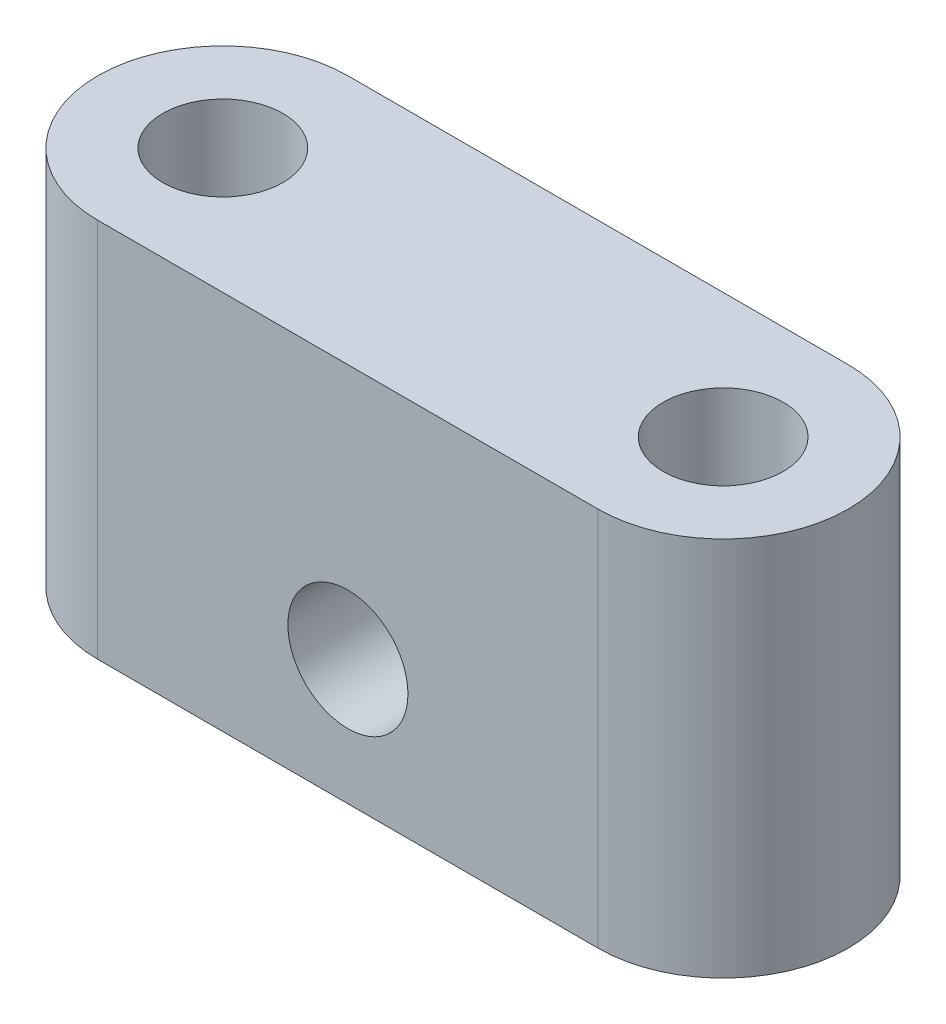
ISO-10303-21;
HEADER;
FILE_DESCRIPTION(('STEP AP214'),'2;1');
FILE_NAME('part.step','',(''),(''),'','','');
FILE_SCHEMA(('AUTOMOTIVE_DESIGN { 1 0 10303 214 1 1 1 1 }'));
ENDSEC;
DATA;
#1=APPLICATION_CONTEXT('core data for automotive mechanical design processes');
#2=APPLICATION_PROTOCOL_DEFINITION('international standard','automotive_design',2000,#1);
#3=PRODUCT_CONTEXT('',#1,'mechanical');
#4=PRODUCT('Part','Part','',(#3));
#5=PRODUCT_RELATED_PRODUCT_CATEGORY('part','',(#4));
#6=PRODUCT_DEFINITION_FORMATION('','',#4);
#7=PRODUCT_DEFINITION_CONTEXT('part definition',#1,'design');
#8=PRODUCT_DEFINITION('design','',#6,#7);
#9=PRODUCT_DEFINITION_SHAPE('','',#8);
#10=(LENGTH_UNIT() NAMED_UNIT(*) SI_UNIT(.MILLI.,.METRE.));
#11=(NAMED_UNIT(*) PLANE_ANGLE_UNIT() SI_UNIT($,.RADIAN.));
#12=(NAMED_UNIT(*) SI_UNIT($,.STERADIAN.) SOLID_ANGLE_UNIT());
#13=UNCERTAINTY_MEASURE_WITH_UNIT(LENGTH_MEASURE(1.E-05),#10,'distance_accuracy_value','');
#14=(GEOMETRIC_REPRESENTATION_CONTEXT(3) GLOBAL_UNCERTAINTY_ASSIGNED_CONTEXT((#13)) GLOBAL_UNIT_ASSIGNED_CONTEXT((#10,
#11,#12)) REPRESENTATION_CONTEXT('',''));
#15=CARTESIAN_POINT('',(0.,0.,0.));
#16=DIRECTION('',(0.,0.,1.));
#17=DIRECTION('',(1.,0.,0.));
#18=AXIS2_PLACEMENT_3D('',#15,#16,#17);
#19=CARTESIAN_POINT('',(-25.,19.,0.));
#20=DIRECTION('',(0.,1.,0.));
#21=DIRECTION('',(0.,0.,1.));
#22=AXIS2_PLACEMENT_3D('',#19,#20,#21);
#23=PLANE('',#22);
#24=CARTESIAN_POINT('',(-25.,19.,0.));
#25=DIRECTION('',(0.,1.,0.));
#26=DIRECTION('',(0.,0.,1.));
#27=AXIS2_PLACEMENT_3D('',#24,#25,#26);
#28=CIRCLE('',#27,6.);
#29=CARTESIAN_POINT('',(-25.,19.,6.));
#30=VERTEX_POINT('',#29);
#31=EDGE_CURVE('E118',#30,#30,#28,.T.);
#32=ORIENTED_EDGE('',*,*,#31,.F.);
#33=EDGE_LOOP('',(#32));
#34=FACE_BOUND('',#33,.T.);
#35=CARTESIAN_POINT('',(-25.,19.,0.));
#36=DIRECTION('',(0.,1.,0.));
#37=DIRECTION('',(0.,0.,1.));
#38=AXIS2_PLACEMENT_3D('',#35,#36,#37);
#39=CIRCLE('',#38,12.5);
#40=CARTESIAN_POINT('',(-25.,19.,-12.5));
#41=VERTEX_POINT('',#40);
#42=CARTESIAN_POINT('',(-25.,19.,12.5));
#43=VERTEX_POINT('',#42);
#44=EDGE_CURVE('E98',#41,#43,#39,.T.);
#45=ORIENTED_EDGE('',*,*,#44,.T.);
#46=DIRECTION('',(1.,0.,0.));
#47=VECTOR('',#46,1.);
#48=CARTESIAN_POINT('',(-25.,19.,12.5));
#49=LINE('',#48,#47);
#50=CARTESIAN_POINT('',(25.,19.,12.5));
#51=VERTEX_POINT('',#50);
#52=EDGE_CURVE('E93',#43,#51,#49,.T.);
#53=ORIENTED_EDGE('',*,*,#52,.T.);
#54=CARTESIAN_POINT('',(25.,19.,0.));
#55=DIRECTION('',(0.,1.,0.));
#56=DIRECTION('',(0.,0.,1.));
#57=AXIS2_PLACEMENT_3D('',#54,#55,#56);
#58=CIRCLE('',#57,12.5);
#59=CARTESIAN_POINT('',(25.,19.,-12.5));
#60=VERTEX_POINT('',#59);
#61=EDGE_CURVE('E96',#51,#60,#58,.T.);
#62=ORIENTED_EDGE('',*,*,#61,.T.);
#63=DIRECTION('',(-1.,0.,0.));
#64=VECTOR('',#63,1.);
#65=CARTESIAN_POINT('',(-25.,19.,-12.5));
#66=LINE('',#65,#64);
#67=EDGE_CURVE('E63',#60,#41,#66,.T.);
#68=ORIENTED_EDGE('',*,*,#67,.T.);
#69=EDGE_LOOP('',(#45,#53,#62,#68));
#70=FACE_BOUND('',#69,.T.);
#71=CARTESIAN_POINT('',(25.,19.,0.));
#72=DIRECTION('',(0.,1.,0.));
#73=DIRECTION('',(0.,0.,1.));
#74=AXIS2_PLACEMENT_3D('',#71,#72,#73);
#75=CIRCLE('',#74,6.);
#76=CARTESIAN_POINT('',(25.,19.,5.99999999999999));
#77=VERTEX_POINT('',#76);
#78=EDGE_CURVE('E140',#77,#77,#75,.T.);
#79=ORIENTED_EDGE('',*,*,#78,.F.);
#80=EDGE_LOOP('',(#79));
#81=FACE_BOUND('',#80,.T.);
#82=ADVANCED_FACE('F45',(#34,#70,#81),#23,.T.);
#83=CARTESIAN_POINT('',(-25.,-19.,0.));
#84=DIRECTION('',(0.,1.,0.));
#85=DIRECTION('',(0.,0.,1.));
#86=AXIS2_PLACEMENT_3D('',#83,#84,#85);
#87=PLANE('',#86);
#88=CARTESIAN_POINT('',(-25.,-19.,0.));
#89=DIRECTION('',(0.,1.,0.));
#90=DIRECTION('',(0.,0.,1.));
#91=AXIS2_PLACEMENT_3D('',#88,#89,#90);
#92=CIRCLE('',#91,12.5);
#93=CARTESIAN_POINT('',(-25.,-19.,-12.5));
#94=VERTEX_POINT('',#93);
#95=CARTESIAN_POINT('',(-25.,-19.,12.5));
#96=VERTEX_POINT('',#95);
#97=EDGE_CURVE('E114',#94,#96,#92,.T.);
#98=ORIENTED_EDGE('',*,*,#97,.F.);
#99=DIRECTION('',(-1.,0.,0.));
#100=VECTOR('',#99,1.);
#101=CARTESIAN_POINT('',(-25.,-19.,-12.5));
#102=LINE('',#101,#100);
#103=CARTESIAN_POINT('',(25.,-19.,-12.5));
#104=VERTEX_POINT('',#103);
#105=EDGE_CURVE('E86',#104,#94,#102,.T.);
#106=ORIENTED_EDGE('',*,*,#105,.F.);
#107=CARTESIAN_POINT('',(25.,-19.,0.));
#108=DIRECTION('',(0.,1.,0.));
#109=DIRECTION('',(0.,0.,1.));
#110=AXIS2_PLACEMENT_3D('',#107,#108,#109);
#111=CIRCLE('',#110,12.5);
#112=CARTESIAN_POINT('',(25.,-19.,12.5));
#113=VERTEX_POINT('',#112);
#114=EDGE_CURVE('E80',#113,#104,#111,.T.);
#115=ORIENTED_EDGE('',*,*,#114,.F.);
#116=DIRECTION('',(1.,0.,0.));
#117=VECTOR('',#116,1.);
#118=CARTESIAN_POINT('',(-25.,-19.,12.5));
#119=LINE('',#118,#117);
#120=EDGE_CURVE('E103',#96,#113,#119,.T.);
#121=ORIENTED_EDGE('',*,*,#120,.F.);
#122=EDGE_LOOP('',(#98,#106,#115,#121));
#123=FACE_BOUND('',#122,.T.);
#124=CARTESIAN_POINT('',(-25.,-19.,0.));
#125=DIRECTION('',(0.,1.,0.));
#126=DIRECTION('',(0.,0.,1.));
#127=AXIS2_PLACEMENT_3D('',#124,#125,#126);
#128=CIRCLE('',#127,6.);
#129=CARTESIAN_POINT('',(-25.,-19.,6.));
#130=VERTEX_POINT('',#129);
#131=EDGE_CURVE('E136',#130,#130,#128,.T.);
#132=ORIENTED_EDGE('',*,*,#131,.T.);
#133=EDGE_LOOP('',(#132));
#134=FACE_BOUND('',#133,.T.);
#135=CARTESIAN_POINT('',(25.,-19.,0.));
#136=DIRECTION('',(0.,1.,0.));
#137=DIRECTION('',(0.,0.,1.));
#138=AXIS2_PLACEMENT_3D('',#135,#136,#137);
#139=CIRCLE('',#138,6.);
#140=CARTESIAN_POINT('',(25.,-19.,5.99999999999999));
#141=VERTEX_POINT('',#140);
#142=EDGE_CURVE('E144',#141,#141,#139,.T.);
#143=ORIENTED_EDGE('',*,*,#142,.T.);
#144=EDGE_LOOP('',(#143));
#145=FACE_BOUND('',#144,.T.);
#146=ADVANCED_FACE('F131',(#123,#134,#145),#87,.F.);
#147=CARTESIAN_POINT('',(-25.,19.,0.));
#148=DIRECTION('',(0.,-1.,0.));
#149=DIRECTION('',(0.,0.,-1.));
#150=AXIS2_PLACEMENT_3D('',#147,#148,#149);
#151=CYLINDRICAL_SURFACE('',#150,12.5);
#152=ORIENTED_EDGE('',*,*,#97,.T.);
#153=DIRECTION('',(0.,-1.,0.));
#154=VECTOR('',#153,1.);
#155=CARTESIAN_POINT('',(-25.,19.,12.5));
#156=LINE('',#155,#154);
#157=EDGE_CURVE('E11',#43,#96,#156,.T.);
#158=ORIENTED_EDGE('',*,*,#157,.F.);
#159=ORIENTED_EDGE('',*,*,#44,.F.);
#160=DIRECTION('',(0.,-1.,0.));
#161=VECTOR('',#160,1.);
#162=CARTESIAN_POINT('',(-25.,19.,-12.5));
#163=LINE('',#162,#161);
#164=EDGE_CURVE('E110',#41,#94,#163,.T.);
#165=ORIENTED_EDGE('',*,*,#164,.T.);
#166=EDGE_LOOP('',(#152,#158,#159,#165));
#167=FACE_BOUND('',#166,.T.);
#168=ADVANCED_FACE('F47',(#167),#151,.T.);
#169=CARTESIAN_POINT('',(-25.,19.,12.5));
#170=DIRECTION('',(0.,0.,-1.));
#171=DIRECTION('',(-1.,0.,0.));
#172=AXIS2_PLACEMENT_3D('',#169,#170,#171);
#173=PLANE('',#172);
#174=CARTESIAN_POINT('',(0.,-6.5,12.5));
#175=DIRECTION('',(0.,0.,1.));
#176=DIRECTION('',(1.,0.,0.));
#177=AXIS2_PLACEMENT_3D('',#174,#175,#176);
#178=CIRCLE('',#177,6.00000000000001);
#179=CARTESIAN_POINT('',(6.00000000000001,-6.5,12.5));
#180=VERTEX_POINT('',#179);
#181=EDGE_CURVE('E155',#180,#180,#178,.T.);
#182=ORIENTED_EDGE('',*,*,#181,.F.);
#183=EDGE_LOOP('',(#182));
#184=FACE_BOUND('',#183,.T.);
#185=ORIENTED_EDGE('',*,*,#120,.T.);
#186=DIRECTION('',(0.,-1.,0.));
#187=VECTOR('',#186,1.);
#188=CARTESIAN_POINT('',(25.,19.,12.5));
#189=LINE('',#188,#187);
#190=EDGE_CURVE('E55',#51,#113,#189,.T.);
#191=ORIENTED_EDGE('',*,*,#190,.F.);
#192=ORIENTED_EDGE('',*,*,#52,.F.);
#193=ORIENTED_EDGE('',*,*,#157,.T.);
#194=EDGE_LOOP('',(#185,#191,#192,#193));
#195=FACE_BOUND('',#194,.T.);
#196=ADVANCED_FACE('F102',(#184,#195),#173,.F.);
#197=CARTESIAN_POINT('',(25.,19.,0.));
#198=DIRECTION('',(0.,-1.,0.));
#199=DIRECTION('',(0.,0.,-1.));
#200=AXIS2_PLACEMENT_3D('',#197,#198,#199);
#201=CYLINDRICAL_SURFACE('',#200,12.5);
#202=ORIENTED_EDGE('',*,*,#114,.T.);
#203=DIRECTION('',(0.,-1.,0.));
#204=VECTOR('',#203,1.);
#205=CARTESIAN_POINT('',(25.,19.,-12.5));
#206=LINE('',#205,#204);
#207=EDGE_CURVE('E105',#60,#104,#206,.T.);
#208=ORIENTED_EDGE('',*,*,#207,.F.);
#209=ORIENTED_EDGE('',*,*,#61,.F.);
#210=ORIENTED_EDGE('',*,*,#190,.T.);
#211=EDGE_LOOP('',(#202,#208,#209,#210));
#212=FACE_BOUND('',#211,.T.);
#213=ADVANCED_FACE('F106',(#212),#201,.T.);
#214=CARTESIAN_POINT('',(-25.,19.,-12.5));
#215=DIRECTION('',(0.,0.,1.));
#216=DIRECTION('',(1.,0.,0.));
#217=AXIS2_PLACEMENT_3D('',#214,#215,#216);
#218=PLANE('',#217);
#219=ORIENTED_EDGE('',*,*,#105,.T.);
#220=ORIENTED_EDGE('',*,*,#164,.F.);
#221=ORIENTED_EDGE('',*,*,#67,.F.);
#222=ORIENTED_EDGE('',*,*,#207,.T.);
#223=EDGE_LOOP('',(#219,#220,#221,#222));
#224=FACE_BOUND('',#223,.T.);
#225=ADVANCED_FACE('F128',(#224),#218,.F.);
#226=CARTESIAN_POINT('',(-25.,19.,0.));
#227=DIRECTION('',(0.,-1.,0.));
#228=DIRECTION('',(0.,0.,-1.));
#229=AXIS2_PLACEMENT_3D('',#226,#227,#228);
#230=CYLINDRICAL_SURFACE('',#229,6.);
#231=ORIENTED_EDGE('',*,*,#31,.T.);
#232=EDGE_LOOP('',(#231));
#233=FACE_BOUND('',#232,.T.);
#234=ORIENTED_EDGE('',*,*,#131,.F.);
#235=EDGE_LOOP('',(#234));
#236=FACE_BOUND('',#235,.T.);
#237=ADVANCED_FACE('F179',(#233,#236),#230,.F.);
#238=CARTESIAN_POINT('',(25.,19.,0.));
#239=DIRECTION('',(0.,-1.,0.));
#240=DIRECTION('',(0.,0.,-1.));
#241=AXIS2_PLACEMENT_3D('',#238,#239,#240);
#242=CYLINDRICAL_SURFACE('',#241,6.);
#243=ORIENTED_EDGE('',*,*,#78,.T.);
#244=EDGE_LOOP('',(#243));
#245=FACE_BOUND('',#244,.T.);
#246=ORIENTED_EDGE('',*,*,#142,.F.);
#247=EDGE_LOOP('',(#246));
#248=FACE_BOUND('',#247,.T.);
#249=ADVANCED_FACE('F186',(#245,#248),#242,.F.);
#250=CARTESIAN_POINT('',(0.,-6.5,0.));
#251=DIRECTION('',(0.,0.,-1.));
#252=DIRECTION('',(-1.,0.,0.));
#253=AXIS2_PLACEMENT_3D('',#250,#251,#252);
#254=PLANE('',#253);
#255=CARTESIAN_POINT('',(0.,-6.5,0.));
#256=DIRECTION('',(0.,0.,1.));
#257=DIRECTION('',(1.,0.,0.));
#258=AXIS2_PLACEMENT_3D('',#255,#256,#257);
#259=CIRCLE('',#258,6.00000000000001);
#260=CARTESIAN_POINT('',(6.00000000000001,-6.5,0.));
#261=VERTEX_POINT('',#260);
#262=EDGE_CURVE('E148',#261,#261,#259,.T.);
#263=ORIENTED_EDGE('',*,*,#262,.T.);
#264=EDGE_LOOP('',(#263));
#265=FACE_BOUND('',#264,.T.);
#266=ADVANCED_FACE('F190',(#265),#254,.F.);
#267=CARTESIAN_POINT('',(0.,-6.5,12.5));
#268=DIRECTION('',(0.,0.,1.));
#269=DIRECTION('',(1.,0.,0.));
#270=AXIS2_PLACEMENT_3D('',#267,#268,#269);
#271=CYLINDRICAL_SURFACE('',#270,6.00000000000001);
#272=ORIENTED_EDGE('',*,*,#262,.F.);
#273=EDGE_LOOP('',(#272));
#274=FACE_BOUND('',#273,.T.);
#275=ORIENTED_EDGE('',*,*,#181,.T.);
#276=EDGE_LOOP('',(#275));
#277=FACE_BOUND('',#276,.T.);
#278=ADVANCED_FACE('F160',(#274,#277),#271,.F.);
#279=CLOSED_SHELL('',(#82,#146,#168,#196,#213,#225,#237,#249,#266,#278));
#280=MANIFOLD_SOLID_BREP('B2',#279);
#281=ADVANCED_BREP_SHAPE_REPRESENTATION('',(#18,#280),#14);
#282=SHAPE_DEFINITION_REPRESENTATION(#9,#281);
ENDSEC;
END-ISO-10303-21;
